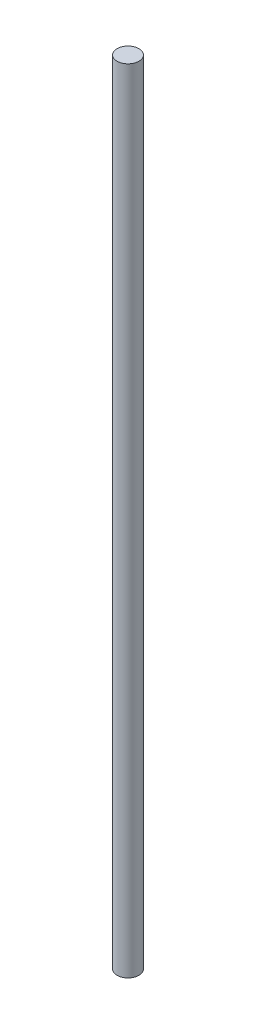
ISO-10303-21;
HEADER;
FILE_DESCRIPTION(('STEP AP214'),'2;1');
FILE_NAME('part.step','',(''),(''),'','','');
FILE_SCHEMA(('AUTOMOTIVE_DESIGN { 1 0 10303 214 1 1 1 1 }'));
ENDSEC;
DATA;
#1=APPLICATION_CONTEXT('core data for automotive mechanical design processes');
#2=APPLICATION_PROTOCOL_DEFINITION('international standard','automotive_design',2000,#1);
#3=PRODUCT_CONTEXT('',#1,'mechanical');
#4=PRODUCT('Part','Part','',(#3));
#5=PRODUCT_RELATED_PRODUCT_CATEGORY('part','',(#4));
#6=PRODUCT_DEFINITION_FORMATION('','',#4);
#7=PRODUCT_DEFINITION_CONTEXT('part definition',#1,'design');
#8=PRODUCT_DEFINITION('design','',#6,#7);
#9=PRODUCT_DEFINITION_SHAPE('','',#8);
#10=(LENGTH_UNIT() NAMED_UNIT(*) SI_UNIT(.MILLI.,.METRE.));
#11=(NAMED_UNIT(*) PLANE_ANGLE_UNIT() SI_UNIT($,.RADIAN.));
#12=(NAMED_UNIT(*) SI_UNIT($,.STERADIAN.) SOLID_ANGLE_UNIT());
#13=UNCERTAINTY_MEASURE_WITH_UNIT(LENGTH_MEASURE(1.E-05),#10,'distance_accuracy_value','');
#14=(GEOMETRIC_REPRESENTATION_CONTEXT(3) GLOBAL_UNCERTAINTY_ASSIGNED_CONTEXT((#13)) GLOBAL_UNIT_ASSIGNED_CONTEXT((#10,
#11,#12)) REPRESENTATION_CONTEXT('',''));
#15=CARTESIAN_POINT('',(0.,0.,0.));
#16=DIRECTION('',(0.,0.,1.));
#17=DIRECTION('',(1.,0.,0.));
#18=AXIS2_PLACEMENT_3D('',#15,#16,#17);
#19=CARTESIAN_POINT('',(0.,145.,0.));
#20=DIRECTION('',(0.,-1.,0.));
#21=DIRECTION('',(0.,0.,-1.));
#22=AXIS2_PLACEMENT_3D('',#19,#20,#21);
#23=CYLINDRICAL_SURFACE('',#22,2.);
#24=CARTESIAN_POINT('',(0.,145.,0.));
#25=DIRECTION('',(0.,1.,0.));
#26=DIRECTION('',(0.,0.,1.));
#27=AXIS2_PLACEMENT_3D('',#24,#25,#26);
#28=CIRCLE('',#27,2.);
#29=CARTESIAN_POINT('',(0.,145.,2.));
#30=VERTEX_POINT('',#29);
#31=EDGE_CURVE('E10',#30,#30,#28,.T.);
#32=ORIENTED_EDGE('',*,*,#31,.F.);
#33=EDGE_LOOP('',(#32));
#34=FACE_BOUND('',#33,.T.);
#35=CARTESIAN_POINT('',(0.,0.,0.));
#36=DIRECTION('',(0.,1.,0.));
#37=DIRECTION('',(0.,0.,1.));
#38=AXIS2_PLACEMENT_3D('',#35,#36,#37);
#39=CIRCLE('',#38,2.);
#40=CARTESIAN_POINT('',(0.,0.,2.));
#41=VERTEX_POINT('',#40);
#42=EDGE_CURVE('E35',#41,#41,#39,.T.);
#43=ORIENTED_EDGE('',*,*,#42,.T.);
#44=EDGE_LOOP('',(#43));
#45=FACE_BOUND('',#44,.T.);
#46=ADVANCED_FACE('F32',(#34,#45),#23,.T.);
#47=CARTESIAN_POINT('',(0.,145.,0.));
#48=DIRECTION('',(0.,1.,0.));
#49=DIRECTION('',(0.,0.,1.));
#50=AXIS2_PLACEMENT_3D('',#47,#48,#49);
#51=PLANE('',#50);
#52=ORIENTED_EDGE('',*,*,#31,.T.);
#53=EDGE_LOOP('',(#52));
#54=FACE_BOUND('',#53,.T.);
#55=ADVANCED_FACE('F47',(#54),#51,.T.);
#56=CARTESIAN_POINT('',(0.,0.,0.));
#57=DIRECTION('',(0.,1.,0.));
#58=DIRECTION('',(0.,0.,1.));
#59=AXIS2_PLACEMENT_3D('',#56,#57,#58);
#60=PLANE('',#59);
#61=ORIENTED_EDGE('',*,*,#42,.F.);
#62=EDGE_LOOP('',(#61));
#63=FACE_BOUND('',#62,.T.);
#64=ADVANCED_FACE('F45',(#63),#60,.F.);
#65=CLOSED_SHELL('',(#46,#55,#64));
#66=MANIFOLD_SOLID_BREP('B2',#65);
#67=ADVANCED_BREP_SHAPE_REPRESENTATION('',(#18,#66),#14);
#68=SHAPE_DEFINITION_REPRESENTATION(#9,#67);
ENDSEC;
END-ISO-10303-21;
